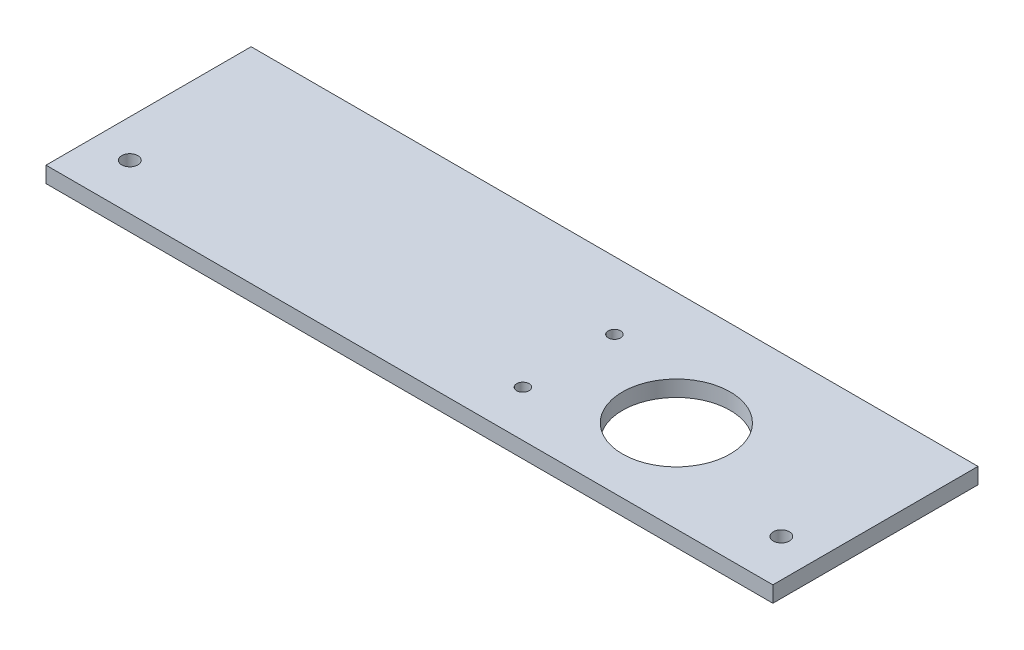
ISO-10303-21;
HEADER;
FILE_DESCRIPTION(('STEP AP214'),'2;1');
FILE_NAME('part.step','',(''),(''),'','','');
FILE_SCHEMA(('AUTOMOTIVE_DESIGN { 1 0 10303 214 1 1 1 1 }'));
ENDSEC;
DATA;
#1=APPLICATION_CONTEXT('core data for automotive mechanical design processes');
#2=APPLICATION_PROTOCOL_DEFINITION('international standard','automotive_design',2000,#1);
#3=PRODUCT_CONTEXT('',#1,'mechanical');
#4=PRODUCT('Part','Part','',(#3));
#5=PRODUCT_RELATED_PRODUCT_CATEGORY('part','',(#4));
#6=PRODUCT_DEFINITION_FORMATION('','',#4);
#7=PRODUCT_DEFINITION_CONTEXT('part definition',#1,'design');
#8=PRODUCT_DEFINITION('design','',#6,#7);
#9=PRODUCT_DEFINITION_SHAPE('','',#8);
#10=(LENGTH_UNIT() NAMED_UNIT(*) SI_UNIT(.MILLI.,.METRE.));
#11=(NAMED_UNIT(*) PLANE_ANGLE_UNIT() SI_UNIT($,.RADIAN.));
#12=(NAMED_UNIT(*) SI_UNIT($,.STERADIAN.) SOLID_ANGLE_UNIT());
#13=UNCERTAINTY_MEASURE_WITH_UNIT(LENGTH_MEASURE(1.E-05),#10,'distance_accuracy_value','');
#14=(GEOMETRIC_REPRESENTATION_CONTEXT(3) GLOBAL_UNCERTAINTY_ASSIGNED_CONTEXT((#13)) GLOBAL_UNIT_ASSIGNED_CONTEXT((#10,
#11,#12)) REPRESENTATION_CONTEXT('',''));
#15=CARTESIAN_POINT('',(0.,0.,0.));
#16=DIRECTION('',(0.,0.,1.));
#17=DIRECTION('',(1.,0.,0.));
#18=AXIS2_PLACEMENT_3D('',#15,#16,#17);
#19=CARTESIAN_POINT('',(0.,2.9718,0.));
#20=DIRECTION('',(0.,-1.,0.));
#21=DIRECTION('',(0.,0.,-1.));
#22=AXIS2_PLACEMENT_3D('',#19,#20,#21);
#23=PLANE('',#22);
#24=CARTESIAN_POINT('',(128.,2.9718,-8.5718));
#25=DIRECTION('',(0.,1.,0.));
#26=DIRECTION('',(0.,0.,1.));
#27=AXIS2_PLACEMENT_3D('',#24,#25,#26);
#28=CIRCLE('',#27,1.5);
#29=CARTESIAN_POINT('',(128.,2.9718,-7.0718));
#30=VERTEX_POINT('',#29);
#31=EDGE_CURVE('E162',#30,#30,#28,.T.);
#32=ORIENTED_EDGE('',*,*,#31,.F.);
#33=EDGE_LOOP('',(#32));
#34=FACE_BOUND('',#33,.T.);
#35=CARTESIAN_POINT('',(7.,2.9718,-8.5718));
#36=DIRECTION('',(0.,1.,0.));
#37=DIRECTION('',(0.,0.,1.));
#38=AXIS2_PLACEMENT_3D('',#35,#36,#37);
#39=CIRCLE('',#38,1.5);
#40=CARTESIAN_POINT('',(7.,2.9718,-7.0718));
#41=VERTEX_POINT('',#40);
#42=EDGE_CURVE('E154',#41,#41,#39,.T.);
#43=ORIENTED_EDGE('',*,*,#42,.F.);
#44=EDGE_LOOP('',(#43));
#45=FACE_BOUND('',#44,.T.);
#46=DIRECTION('',(0.,0.,1.));
#47=VECTOR('',#46,1.);
#48=CARTESIAN_POINT('',(0.,2.9718,0.));
#49=LINE('',#48,#47);
#50=CARTESIAN_POINT('',(0.,2.9718,-38.1));
#51=VERTEX_POINT('',#50);
#52=CARTESIAN_POINT('',(0.,2.9718,0.));
#53=VERTEX_POINT('',#52);
#54=EDGE_CURVE('E92',#51,#53,#49,.T.);
#55=ORIENTED_EDGE('',*,*,#54,.T.);
#56=DIRECTION('',(1.,0.,0.));
#57=VECTOR('',#56,1.);
#58=CARTESIAN_POINT('',(0.,2.9718,0.));
#59=LINE('',#58,#57);
#60=CARTESIAN_POINT('',(135.,2.9718,0.));
#61=VERTEX_POINT('',#60);
#62=EDGE_CURVE('E87',#53,#61,#59,.T.);
#63=ORIENTED_EDGE('',*,*,#62,.T.);
#64=DIRECTION('',(0.,0.,-1.));
#65=VECTOR('',#64,1.);
#66=CARTESIAN_POINT('',(135.,2.9718,0.));
#67=LINE('',#66,#65);
#68=CARTESIAN_POINT('',(135.,2.9718,-38.1));
#69=VERTEX_POINT('',#68);
#70=EDGE_CURVE('E90',#61,#69,#67,.T.);
#71=ORIENTED_EDGE('',*,*,#70,.T.);
#72=DIRECTION('',(-1.,0.,0.));
#73=VECTOR('',#72,1.);
#74=CARTESIAN_POINT('',(0.,2.9718,-38.1));
#75=LINE('',#74,#73);
#76=EDGE_CURVE('E57',#69,#51,#75,.T.);
#77=ORIENTED_EDGE('',*,*,#76,.T.);
#78=EDGE_LOOP('',(#55,#63,#71,#77));
#79=FACE_BOUND('',#78,.T.);
#80=CARTESIAN_POINT('',(80.,2.9718,-8.5718));
#81=DIRECTION('',(0.,1.,0.));
#82=DIRECTION('',(0.,0.,1.));
#83=AXIS2_PLACEMENT_3D('',#80,#81,#82);
#84=CIRCLE('',#83,1.15);
#85=CARTESIAN_POINT('',(80.,2.9718,-7.4218));
#86=VERTEX_POINT('',#85);
#87=EDGE_CURVE('E112',#86,#86,#84,.T.);
#88=ORIENTED_EDGE('',*,*,#87,.F.);
#89=EDGE_LOOP('',(#88));
#90=FACE_BOUND('',#89,.T.);
#91=CARTESIAN_POINT('',(80.,2.9718,-25.5718));
#92=DIRECTION('',(0.,1.,0.));
#93=DIRECTION('',(0.,0.,1.));
#94=AXIS2_PLACEMENT_3D('',#91,#92,#93);
#95=CIRCLE('',#94,1.15);
#96=CARTESIAN_POINT('',(80.,2.9718,-24.4218));
#97=VERTEX_POINT('',#96);
#98=EDGE_CURVE('E134',#97,#97,#95,.T.);
#99=ORIENTED_EDGE('',*,*,#98,.F.);
#100=EDGE_LOOP('',(#99));
#101=FACE_BOUND('',#100,.T.);
#102=CARTESIAN_POINT('',(100.,2.9718,-17.0718));
#103=DIRECTION('',(0.,1.,0.));
#104=DIRECTION('',(0.,0.,1.));
#105=AXIS2_PLACEMENT_3D('',#102,#103,#104);
#106=CIRCLE('',#105,9.99999999999999);
#107=CARTESIAN_POINT('',(100.,2.9718,-7.0718));
#108=VERTEX_POINT('',#107);
#109=EDGE_CURVE('E142',#108,#108,#106,.T.);
#110=ORIENTED_EDGE('',*,*,#109,.F.);
#111=EDGE_LOOP('',(#110));
#112=FACE_BOUND('',#111,.T.);
#113=ADVANCED_FACE('F39',(#34,#45,#79,#90,#101,#112),#23,.F.);
#114=CARTESIAN_POINT('',(0.,0.,0.));
#115=DIRECTION('',(0.,-1.,0.));
#116=DIRECTION('',(0.,0.,-1.));
#117=AXIS2_PLACEMENT_3D('',#114,#115,#116);
#118=PLANE('',#117);
#119=CARTESIAN_POINT('',(128.,0.,-8.5718));
#120=DIRECTION('',(0.,1.,0.));
#121=DIRECTION('',(0.,0.,1.));
#122=AXIS2_PLACEMENT_3D('',#119,#120,#121);
#123=CIRCLE('',#122,1.5);
#124=CARTESIAN_POINT('',(128.,0.,-7.0718));
#125=VERTEX_POINT('',#124);
#126=EDGE_CURVE('E150',#125,#125,#123,.T.);
#127=ORIENTED_EDGE('',*,*,#126,.T.);
#128=EDGE_LOOP('',(#127));
#129=FACE_BOUND('',#128,.T.);
#130=CARTESIAN_POINT('',(7.,0.,-8.5718));
#131=DIRECTION('',(0.,1.,0.));
#132=DIRECTION('',(0.,0.,1.));
#133=AXIS2_PLACEMENT_3D('',#130,#131,#132);
#134=CIRCLE('',#133,1.5);
#135=CARTESIAN_POINT('',(7.,0.,-7.0718));
#136=VERTEX_POINT('',#135);
#137=EDGE_CURVE('E158',#136,#136,#134,.T.);
#138=ORIENTED_EDGE('',*,*,#137,.T.);
#139=EDGE_LOOP('',(#138));
#140=FACE_BOUND('',#139,.T.);
#141=CARTESIAN_POINT('',(80.,0.,-25.5718));
#142=DIRECTION('',(0.,1.,0.));
#143=DIRECTION('',(0.,0.,1.));
#144=AXIS2_PLACEMENT_3D('',#141,#142,#143);
#145=CIRCLE('',#144,1.15);
#146=CARTESIAN_POINT('',(80.,0.,-24.4218));
#147=VERTEX_POINT('',#146);
#148=EDGE_CURVE('E138',#147,#147,#145,.T.);
#149=ORIENTED_EDGE('',*,*,#148,.T.);
#150=EDGE_LOOP('',(#149));
#151=FACE_BOUND('',#150,.T.);
#152=DIRECTION('',(0.,0.,1.));
#153=VECTOR('',#152,1.);
#154=CARTESIAN_POINT('',(0.,0.,0.));
#155=LINE('',#154,#153);
#156=CARTESIAN_POINT('',(0.,0.,-38.1));
#157=VERTEX_POINT('',#156);
#158=CARTESIAN_POINT('',(0.,0.,0.));
#159=VERTEX_POINT('',#158);
#160=EDGE_CURVE('E108',#157,#159,#155,.T.);
#161=ORIENTED_EDGE('',*,*,#160,.F.);
#162=DIRECTION('',(-1.,0.,0.));
#163=VECTOR('',#162,1.);
#164=CARTESIAN_POINT('',(0.,0.,-38.1));
#165=LINE('',#164,#163);
#166=CARTESIAN_POINT('',(135.,0.,-38.1));
#167=VERTEX_POINT('',#166);
#168=EDGE_CURVE('E80',#167,#157,#165,.T.);
#169=ORIENTED_EDGE('',*,*,#168,.F.);
#170=DIRECTION('',(0.,0.,-1.));
#171=VECTOR('',#170,1.);
#172=CARTESIAN_POINT('',(135.,0.,0.));
#173=LINE('',#172,#171);
#174=CARTESIAN_POINT('',(135.,0.,0.));
#175=VERTEX_POINT('',#174);
#176=EDGE_CURVE('E74',#175,#167,#173,.T.);
#177=ORIENTED_EDGE('',*,*,#176,.F.);
#178=DIRECTION('',(1.,0.,0.));
#179=VECTOR('',#178,1.);
#180=CARTESIAN_POINT('',(0.,0.,0.));
#181=LINE('',#180,#179);
#182=EDGE_CURVE('E97',#159,#175,#181,.T.);
#183=ORIENTED_EDGE('',*,*,#182,.F.);
#184=EDGE_LOOP('',(#161,#169,#177,#183));
#185=FACE_BOUND('',#184,.T.);
#186=CARTESIAN_POINT('',(80.,0.,-8.5718));
#187=DIRECTION('',(0.,1.,0.));
#188=DIRECTION('',(0.,0.,1.));
#189=AXIS2_PLACEMENT_3D('',#186,#187,#188);
#190=CIRCLE('',#189,1.15);
#191=CARTESIAN_POINT('',(80.,0.,-7.4218));
#192=VERTEX_POINT('',#191);
#193=EDGE_CURVE('E130',#192,#192,#190,.T.);
#194=ORIENTED_EDGE('',*,*,#193,.T.);
#195=EDGE_LOOP('',(#194));
#196=FACE_BOUND('',#195,.T.);
#197=CARTESIAN_POINT('',(100.,0.,-17.0718));
#198=DIRECTION('',(0.,1.,0.));
#199=DIRECTION('',(0.,0.,1.));
#200=AXIS2_PLACEMENT_3D('',#197,#198,#199);
#201=CIRCLE('',#200,9.99999999999999);
#202=CARTESIAN_POINT('',(100.,0.,-7.0718));
#203=VERTEX_POINT('',#202);
#204=EDGE_CURVE('E146',#203,#203,#201,.T.);
#205=ORIENTED_EDGE('',*,*,#204,.T.);
#206=EDGE_LOOP('',(#205));
#207=FACE_BOUND('',#206,.T.);
#208=ADVANCED_FACE('F125',(#129,#140,#151,#185,#196,#207),#118,.T.);
#209=CARTESIAN_POINT('',(0.,2.9718,0.));
#210=DIRECTION('',(1.,0.,0.));
#211=DIRECTION('',(0.,0.,-1.));
#212=AXIS2_PLACEMENT_3D('',#209,#210,#211);
#213=PLANE('',#212);
#214=ORIENTED_EDGE('',*,*,#160,.T.);
#215=DIRECTION('',(0.,-1.,0.));
#216=VECTOR('',#215,1.);
#217=CARTESIAN_POINT('',(0.,2.9718,0.));
#218=LINE('',#217,#216);
#219=EDGE_CURVE('E11',#53,#159,#218,.T.);
#220=ORIENTED_EDGE('',*,*,#219,.F.);
#221=ORIENTED_EDGE('',*,*,#54,.F.);
#222=DIRECTION('',(0.,-1.,0.));
#223=VECTOR('',#222,1.);
#224=CARTESIAN_POINT('',(0.,2.9718,-38.1));
#225=LINE('',#224,#223);
#226=EDGE_CURVE('E104',#51,#157,#225,.T.);
#227=ORIENTED_EDGE('',*,*,#226,.T.);
#228=EDGE_LOOP('',(#214,#220,#221,#227));
#229=FACE_BOUND('',#228,.T.);
#230=ADVANCED_FACE('F41',(#229),#213,.F.);
#231=CARTESIAN_POINT('',(0.,2.9718,0.));
#232=DIRECTION('',(0.,0.,-1.));
#233=DIRECTION('',(-1.,0.,0.));
#234=AXIS2_PLACEMENT_3D('',#231,#232,#233);
#235=PLANE('',#234);
#236=ORIENTED_EDGE('',*,*,#182,.T.);
#237=DIRECTION('',(0.,-1.,0.));
#238=VECTOR('',#237,1.);
#239=CARTESIAN_POINT('',(135.,2.9718,0.));
#240=LINE('',#239,#238);
#241=EDGE_CURVE('E49',#61,#175,#240,.T.);
#242=ORIENTED_EDGE('',*,*,#241,.F.);
#243=ORIENTED_EDGE('',*,*,#62,.F.);
#244=ORIENTED_EDGE('',*,*,#219,.T.);
#245=EDGE_LOOP('',(#236,#242,#243,#244));
#246=FACE_BOUND('',#245,.T.);
#247=ADVANCED_FACE('F96',(#246),#235,.F.);
#248=CARTESIAN_POINT('',(135.,2.9718,0.));
#249=DIRECTION('',(-1.,0.,0.));
#250=DIRECTION('',(0.,0.,1.));
#251=AXIS2_PLACEMENT_3D('',#248,#249,#250);
#252=PLANE('',#251);
#253=ORIENTED_EDGE('',*,*,#176,.T.);
#254=DIRECTION('',(0.,-1.,0.));
#255=VECTOR('',#254,1.);
#256=CARTESIAN_POINT('',(135.,2.9718,-38.1));
#257=LINE('',#256,#255);
#258=EDGE_CURVE('E99',#69,#167,#257,.T.);
#259=ORIENTED_EDGE('',*,*,#258,.F.);
#260=ORIENTED_EDGE('',*,*,#70,.F.);
#261=ORIENTED_EDGE('',*,*,#241,.T.);
#262=EDGE_LOOP('',(#253,#259,#260,#261));
#263=FACE_BOUND('',#262,.T.);
#264=ADVANCED_FACE('F100',(#263),#252,.F.);
#265=CARTESIAN_POINT('',(0.,2.9718,-38.1));
#266=DIRECTION('',(0.,0.,1.));
#267=DIRECTION('',(1.,0.,0.));
#268=AXIS2_PLACEMENT_3D('',#265,#266,#267);
#269=PLANE('',#268);
#270=ORIENTED_EDGE('',*,*,#168,.T.);
#271=ORIENTED_EDGE('',*,*,#226,.F.);
#272=ORIENTED_EDGE('',*,*,#76,.F.);
#273=ORIENTED_EDGE('',*,*,#258,.T.);
#274=EDGE_LOOP('',(#270,#271,#272,#273));
#275=FACE_BOUND('',#274,.T.);
#276=ADVANCED_FACE('F122',(#275),#269,.F.);
#277=CARTESIAN_POINT('',(80.,2.9718,-8.5718));
#278=DIRECTION('',(0.,-1.,0.));
#279=DIRECTION('',(0.,0.,-1.));
#280=AXIS2_PLACEMENT_3D('',#277,#278,#279);
#281=CYLINDRICAL_SURFACE('',#280,1.15);
#282=ORIENTED_EDGE('',*,*,#87,.T.);
#283=EDGE_LOOP('',(#282));
#284=FACE_BOUND('',#283,.T.);
#285=ORIENTED_EDGE('',*,*,#193,.F.);
#286=EDGE_LOOP('',(#285));
#287=FACE_BOUND('',#286,.T.);
#288=ADVANCED_FACE('F198',(#284,#287),#281,.F.);
#289=CARTESIAN_POINT('',(80.,2.9718,-25.5718));
#290=DIRECTION('',(0.,-1.,0.));
#291=DIRECTION('',(0.,0.,-1.));
#292=AXIS2_PLACEMENT_3D('',#289,#290,#291);
#293=CYLINDRICAL_SURFACE('',#292,1.15);
#294=ORIENTED_EDGE('',*,*,#98,.T.);
#295=EDGE_LOOP('',(#294));
#296=FACE_BOUND('',#295,.T.);
#297=ORIENTED_EDGE('',*,*,#148,.F.);
#298=EDGE_LOOP('',(#297));
#299=FACE_BOUND('',#298,.T.);
#300=ADVANCED_FACE('F191',(#296,#299),#293,.F.);
#301=CARTESIAN_POINT('',(100.,2.9718,-17.0718));
#302=DIRECTION('',(0.,-1.,0.));
#303=DIRECTION('',(0.,0.,-1.));
#304=AXIS2_PLACEMENT_3D('',#301,#302,#303);
#305=CYLINDRICAL_SURFACE('',#304,9.99999999999999);
#306=ORIENTED_EDGE('',*,*,#109,.T.);
#307=EDGE_LOOP('',(#306));
#308=FACE_BOUND('',#307,.T.);
#309=ORIENTED_EDGE('',*,*,#204,.F.);
#310=EDGE_LOOP('',(#309));
#311=FACE_BOUND('',#310,.T.);
#312=ADVANCED_FACE('F185',(#308,#311),#305,.F.);
#313=CARTESIAN_POINT('',(7.,0.,-8.5718));
#314=DIRECTION('',(0.,1.,0.));
#315=DIRECTION('',(0.,0.,1.));
#316=AXIS2_PLACEMENT_3D('',#313,#314,#315);
#317=CYLINDRICAL_SURFACE('',#316,1.5);
#318=ORIENTED_EDGE('',*,*,#137,.F.);
#319=EDGE_LOOP('',(#318));
#320=FACE_BOUND('',#319,.T.);
#321=ORIENTED_EDGE('',*,*,#42,.T.);
#322=EDGE_LOOP('',(#321));
#323=FACE_BOUND('',#322,.T.);
#324=ADVANCED_FACE('F175',(#320,#323),#317,.F.);
#325=CARTESIAN_POINT('',(128.,0.,-8.5718));
#326=DIRECTION('',(0.,1.,0.));
#327=DIRECTION('',(0.,0.,1.));
#328=AXIS2_PLACEMENT_3D('',#325,#326,#327);
#329=CYLINDRICAL_SURFACE('',#328,1.5);
#330=ORIENTED_EDGE('',*,*,#126,.F.);
#331=EDGE_LOOP('',(#330));
#332=FACE_BOUND('',#331,.T.);
#333=ORIENTED_EDGE('',*,*,#31,.T.);
#334=EDGE_LOOP('',(#333));
#335=FACE_BOUND('',#334,.T.);
#336=ADVANCED_FACE('F172',(#332,#335),#329,.F.);
#337=CLOSED_SHELL('',(#113,#208,#230,#247,#264,#276,#288,#300,#312,#324,#336));
#338=MANIFOLD_SOLID_BREP('B2',#337);
#339=ADVANCED_BREP_SHAPE_REPRESENTATION('',(#18,#338),#14);
#340=SHAPE_DEFINITION_REPRESENTATION(#9,#339);
ENDSEC;
END-ISO-10303-21;
